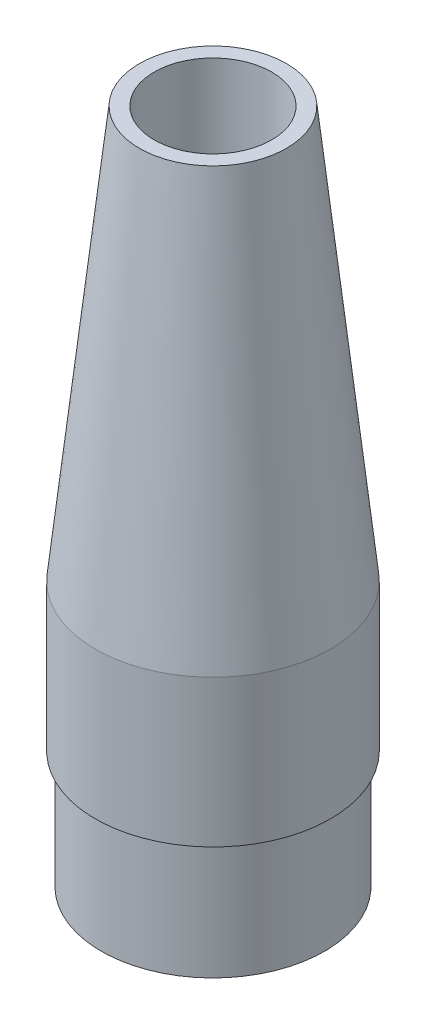
ISO-10303-21;
HEADER;
FILE_DESCRIPTION(('STEP AP214'),'2;1');
FILE_NAME('part.step','',(''),(''),'','','');
FILE_SCHEMA(('AUTOMOTIVE_DESIGN { 1 0 10303 214 1 1 1 1 }'));
ENDSEC;
DATA;
#1=APPLICATION_CONTEXT('core data for automotive mechanical design processes');
#2=APPLICATION_PROTOCOL_DEFINITION('international standard','automotive_design',2000,#1);
#3=PRODUCT_CONTEXT('',#1,'mechanical');
#4=PRODUCT('Part','Part','',(#3));
#5=PRODUCT_RELATED_PRODUCT_CATEGORY('part','',(#4));
#6=PRODUCT_DEFINITION_FORMATION('','',#4);
#7=PRODUCT_DEFINITION_CONTEXT('part definition',#1,'design');
#8=PRODUCT_DEFINITION('design','',#6,#7);
#9=PRODUCT_DEFINITION_SHAPE('','',#8);
#10=(LENGTH_UNIT() NAMED_UNIT(*) SI_UNIT(.MILLI.,.METRE.));
#11=(NAMED_UNIT(*) PLANE_ANGLE_UNIT() SI_UNIT($,.RADIAN.));
#12=(NAMED_UNIT(*) SI_UNIT($,.STERADIAN.) SOLID_ANGLE_UNIT());
#13=UNCERTAINTY_MEASURE_WITH_UNIT(LENGTH_MEASURE(1.E-05),#10,'distance_accuracy_value','');
#14=(GEOMETRIC_REPRESENTATION_CONTEXT(3) GLOBAL_UNCERTAINTY_ASSIGNED_CONTEXT((#13)) GLOBAL_UNIT_ASSIGNED_CONTEXT((#10,
#11,#12)) REPRESENTATION_CONTEXT('',''));
#15=CARTESIAN_POINT('',(0.,0.,0.));
#16=DIRECTION('',(0.,0.,1.));
#17=DIRECTION('',(1.,0.,0.));
#18=AXIS2_PLACEMENT_3D('',#15,#16,#17);
#19=CARTESIAN_POINT('',(0.,0.,0.));
#20=DIRECTION('',(0.,-1.,0.));
#21=DIRECTION('',(0.,0.,-1.));
#22=AXIS2_PLACEMENT_3D('',#19,#20,#21);
#23=CYLINDRICAL_SURFACE('',#22,19.);
#24=CARTESIAN_POINT('',(0.,20.,0.));
#25=DIRECTION('',(0.,-1.,0.));
#26=DIRECTION('',(0.,0.,-1.));
#27=AXIS2_PLACEMENT_3D('',#24,#25,#26);
#28=CIRCLE('',#27,19.);
#29=CARTESIAN_POINT('',(0.,20.,-19.));
#30=VERTEX_POINT('',#29);
#31=EDGE_CURVE('E74',#30,#30,#28,.T.);
#32=ORIENTED_EDGE('',*,*,#31,.T.);
#33=EDGE_LOOP('',(#32));
#34=FACE_BOUND('',#33,.T.);
#35=CARTESIAN_POINT('',(0.,0.,0.));
#36=DIRECTION('',(0.,-1.,0.));
#37=DIRECTION('',(0.,0.,-1.));
#38=AXIS2_PLACEMENT_3D('',#35,#36,#37);
#39=CIRCLE('',#38,19.);
#40=CARTESIAN_POINT('',(0.,0.,-19.));
#41=VERTEX_POINT('',#40);
#42=EDGE_CURVE('E10',#41,#41,#39,.T.);
#43=ORIENTED_EDGE('',*,*,#42,.F.);
#44=EDGE_LOOP('',(#43));
#45=FACE_BOUND('',#44,.T.);
#46=ADVANCED_FACE('F31',(#34,#45),#23,.T.);
#47=CARTESIAN_POINT('',(10.,0.,0.));
#48=DIRECTION('',(0.,-1.,0.));
#49=DIRECTION('',(0.,0.,-1.));
#50=AXIS2_PLACEMENT_3D('',#47,#48,#49);
#51=PLANE('',#50);
#52=ORIENTED_EDGE('',*,*,#42,.T.);
#53=EDGE_LOOP('',(#52));
#54=FACE_BOUND('',#53,.T.);
#55=CARTESIAN_POINT('',(0.,0.,0.));
#56=DIRECTION('',(0.,-1.,0.));
#57=DIRECTION('',(0.,0.,-1.));
#58=AXIS2_PLACEMENT_3D('',#55,#56,#57);
#59=CIRCLE('',#58,10.);
#60=CARTESIAN_POINT('',(0.,0.,-10.));
#61=VERTEX_POINT('',#60);
#62=EDGE_CURVE('E37',#61,#61,#59,.T.);
#63=ORIENTED_EDGE('',*,*,#62,.F.);
#64=EDGE_LOOP('',(#63));
#65=FACE_BOUND('',#64,.T.);
#66=ADVANCED_FACE('F92',(#54,#65),#51,.T.);
#67=CARTESIAN_POINT('',(0.,0.,0.));
#68=DIRECTION('',(0.,-1.,0.));
#69=DIRECTION('',(0.,0.,-1.));
#70=AXIS2_PLACEMENT_3D('',#67,#68,#69);
#71=CYLINDRICAL_SURFACE('',#70,9.99999999999999);
#72=ORIENTED_EDGE('',*,*,#62,.T.);
#73=EDGE_LOOP('',(#72));
#74=FACE_BOUND('',#73,.T.);
#75=CARTESIAN_POINT('',(0.,70.5531926730158,0.));
#76=DIRECTION('',(0.,-1.,0.));
#77=DIRECTION('',(0.,0.,-1.));
#78=AXIS2_PLACEMENT_3D('',#75,#76,#77);
#79=CIRCLE('',#78,9.99999999999999);
#80=CARTESIAN_POINT('',(0.,70.5531926730158,-9.99999999999999));
#81=VERTEX_POINT('',#80);
#82=EDGE_CURVE('E41',#81,#81,#79,.T.);
#83=ORIENTED_EDGE('',*,*,#82,.F.);
#84=EDGE_LOOP('',(#83));
#85=FACE_BOUND('',#84,.T.);
#86=ADVANCED_FACE('F96',(#74,#85),#71,.F.);
#87=CARTESIAN_POINT('',(0.,75.8138195536944,0.));
#88=DIRECTION('',(0.,-1.,0.));
#89=DIRECTION('',(0.,0.,-1.));
#90=AXIS2_PLACEMENT_3D('',#87,#88,#89);
#91=CONICAL_SURFACE('',#90,7.78273050664267,0.398888707048109);
#92=ORIENTED_EDGE('',*,*,#82,.T.);
#93=EDGE_LOOP('',(#92));
#94=FACE_BOUND('',#93,.T.);
#95=CARTESIAN_POINT('',(0.,75.8138195536944,0.));
#96=DIRECTION('',(0.,-1.,0.));
#97=DIRECTION('',(0.,0.,-1.));
#98=AXIS2_PLACEMENT_3D('',#95,#96,#97);
#99=CIRCLE('',#98,7.78273050664267);
#100=CARTESIAN_POINT('',(0.,75.8138195536944,-7.78273050664267));
#101=VERTEX_POINT('',#100);
#102=EDGE_CURVE('E45',#101,#101,#99,.T.);
#103=ORIENTED_EDGE('',*,*,#102,.F.);
#104=EDGE_LOOP('',(#103));
#105=FACE_BOUND('',#104,.T.);
#106=ADVANCED_FACE('F100',(#94,#105),#91,.F.);
#107=CARTESIAN_POINT('',(0.,0.,0.));
#108=DIRECTION('',(0.,-1.,0.));
#109=DIRECTION('',(0.,0.,-1.));
#110=AXIS2_PLACEMENT_3D('',#107,#108,#109);
#111=CYLINDRICAL_SURFACE('',#110,7.78273050664267);
#112=ORIENTED_EDGE('',*,*,#102,.T.);
#113=EDGE_LOOP('',(#112));
#114=FACE_BOUND('',#113,.T.);
#115=CARTESIAN_POINT('',(0.,80.,0.));
#116=DIRECTION('',(0.,-1.,0.));
#117=DIRECTION('',(0.,0.,-1.));
#118=AXIS2_PLACEMENT_3D('',#115,#116,#117);
#119=CIRCLE('',#118,7.78273050664266);
#120=CARTESIAN_POINT('',(0.,80.,-7.78273050664266));
#121=VERTEX_POINT('',#120);
#122=EDGE_CURVE('E50',#121,#121,#119,.T.);
#123=ORIENTED_EDGE('',*,*,#122,.F.);
#124=EDGE_LOOP('',(#123));
#125=FACE_BOUND('',#124,.T.);
#126=ADVANCED_FACE('F106',(#114,#125),#111,.F.);
#127=CARTESIAN_POINT('',(5.,80.,0.));
#128=DIRECTION('',(0.,-1.,0.));
#129=DIRECTION('',(0.,0.,-1.));
#130=AXIS2_PLACEMENT_3D('',#127,#128,#129);
#131=PLANE('',#130);
#132=ORIENTED_EDGE('',*,*,#122,.T.);
#133=EDGE_LOOP('',(#132));
#134=FACE_BOUND('',#133,.T.);
#135=CARTESIAN_POINT('',(0.,80.,0.));
#136=DIRECTION('',(0.,-1.,0.));
#137=DIRECTION('',(0.,0.,-1.));
#138=AXIS2_PLACEMENT_3D('',#135,#136,#137);
#139=CIRCLE('',#138,5.);
#140=CARTESIAN_POINT('',(0.,80.,-5.));
#141=VERTEX_POINT('',#140);
#142=EDGE_CURVE('E53',#141,#141,#139,.T.);
#143=ORIENTED_EDGE('',*,*,#142,.F.);
#144=EDGE_LOOP('',(#143));
#145=FACE_BOUND('',#144,.T.);
#146=ADVANCED_FACE('F110',(#134,#145),#131,.T.);
#147=CARTESIAN_POINT('',(0.,0.,0.));
#148=DIRECTION('',(0.,-1.,0.));
#149=DIRECTION('',(0.,0.,-1.));
#150=AXIS2_PLACEMENT_3D('',#147,#148,#149);
#151=CYLINDRICAL_SURFACE('',#150,5.);
#152=ORIENTED_EDGE('',*,*,#142,.T.);
#153=EDGE_LOOP('',(#152));
#154=FACE_BOUND('',#153,.T.);
#155=CARTESIAN_POINT('',(0.,85.,0.));
#156=DIRECTION('',(0.,-1.,0.));
#157=DIRECTION('',(0.,0.,-1.));
#158=AXIS2_PLACEMENT_3D('',#155,#156,#157);
#159=CIRCLE('',#158,5.);
#160=CARTESIAN_POINT('',(0.,85.,-5.));
#161=VERTEX_POINT('',#160);
#162=EDGE_CURVE('E56',#161,#161,#159,.T.);
#163=ORIENTED_EDGE('',*,*,#162,.F.);
#164=EDGE_LOOP('',(#163));
#165=FACE_BOUND('',#164,.T.);
#166=ADVANCED_FACE('F114',(#154,#165),#151,.F.);
#167=CARTESIAN_POINT('',(10.,85.,0.));
#168=DIRECTION('',(0.,1.,0.));
#169=DIRECTION('',(0.,0.,1.));
#170=AXIS2_PLACEMENT_3D('',#167,#168,#169);
#171=PLANE('',#170);
#172=ORIENTED_EDGE('',*,*,#162,.T.);
#173=EDGE_LOOP('',(#172));
#174=FACE_BOUND('',#173,.T.);
#175=CARTESIAN_POINT('',(0.,85.,0.));
#176=DIRECTION('',(0.,-1.,0.));
#177=DIRECTION('',(0.,0.,-1.));
#178=AXIS2_PLACEMENT_3D('',#175,#176,#177);
#179=CIRCLE('',#178,10.);
#180=CARTESIAN_POINT('',(0.,85.,-10.));
#181=VERTEX_POINT('',#180);
#182=EDGE_CURVE('E59',#181,#181,#179,.T.);
#183=ORIENTED_EDGE('',*,*,#182,.F.);
#184=EDGE_LOOP('',(#183));
#185=FACE_BOUND('',#184,.T.);
#186=ADVANCED_FACE('F118',(#174,#185),#171,.T.);
#187=CARTESIAN_POINT('',(0.,0.,0.));
#188=DIRECTION('',(0.,-1.,0.));
#189=DIRECTION('',(0.,0.,-1.));
#190=AXIS2_PLACEMENT_3D('',#187,#188,#189);
#191=CYLINDRICAL_SURFACE('',#190,10.);
#192=ORIENTED_EDGE('',*,*,#182,.T.);
#193=EDGE_LOOP('',(#192));
#194=FACE_BOUND('',#193,.T.);
#195=CARTESIAN_POINT('',(0.,115.,0.));
#196=DIRECTION('',(0.,-1.,0.));
#197=DIRECTION('',(0.,0.,-1.));
#198=AXIS2_PLACEMENT_3D('',#195,#196,#197);
#199=CIRCLE('',#198,10.);
#200=CARTESIAN_POINT('',(0.,115.,-10.));
#201=VERTEX_POINT('',#200);
#202=EDGE_CURVE('E62',#201,#201,#199,.T.);
#203=ORIENTED_EDGE('',*,*,#202,.F.);
#204=EDGE_LOOP('',(#203));
#205=FACE_BOUND('',#204,.T.);
#206=ADVANCED_FACE('F122',(#194,#205),#191,.F.);
#207=CARTESIAN_POINT('',(12.5,115.,0.));
#208=DIRECTION('',(0.,1.,0.));
#209=DIRECTION('',(0.,0.,1.));
#210=AXIS2_PLACEMENT_3D('',#207,#208,#209);
#211=PLANE('',#210);
#212=ORIENTED_EDGE('',*,*,#202,.T.);
#213=EDGE_LOOP('',(#212));
#214=FACE_BOUND('',#213,.T.);
#215=CARTESIAN_POINT('',(0.,115.,0.));
#216=DIRECTION('',(0.,-1.,0.));
#217=DIRECTION('',(0.,0.,-1.));
#218=AXIS2_PLACEMENT_3D('',#215,#216,#217);
#219=CIRCLE('',#218,12.5);
#220=CARTESIAN_POINT('',(0.,115.,-12.5));
#221=VERTEX_POINT('',#220);
#222=EDGE_CURVE('E65',#221,#221,#219,.T.);
#223=ORIENTED_EDGE('',*,*,#222,.F.);
#224=EDGE_LOOP('',(#223));
#225=FACE_BOUND('',#224,.T.);
#226=ADVANCED_FACE('F126',(#214,#225),#211,.T.);
#227=CARTESIAN_POINT('',(0.,45.,0.));
#228=DIRECTION('',(0.,-1.,0.));
#229=DIRECTION('',(0.,0.,-1.));
#230=AXIS2_PLACEMENT_3D('',#227,#228,#229);
#231=CONICAL_SURFACE('',#230,20.,0.106735672649136);
#232=ORIENTED_EDGE('',*,*,#222,.T.);
#233=EDGE_LOOP('',(#232));
#234=FACE_BOUND('',#233,.T.);
#235=CARTESIAN_POINT('',(0.,45.,0.));
#236=DIRECTION('',(0.,-1.,0.));
#237=DIRECTION('',(0.,0.,-1.));
#238=AXIS2_PLACEMENT_3D('',#235,#236,#237);
#239=CIRCLE('',#238,20.);
#240=CARTESIAN_POINT('',(0.,45.,-20.));
#241=VERTEX_POINT('',#240);
#242=EDGE_CURVE('E68',#241,#241,#239,.T.);
#243=ORIENTED_EDGE('',*,*,#242,.F.);
#244=EDGE_LOOP('',(#243));
#245=FACE_BOUND('',#244,.T.);
#246=ADVANCED_FACE('F88',(#234,#245),#231,.T.);
#247=CARTESIAN_POINT('',(0.,0.,0.));
#248=DIRECTION('',(0.,-1.,0.));
#249=DIRECTION('',(0.,0.,-1.));
#250=AXIS2_PLACEMENT_3D('',#247,#248,#249);
#251=CYLINDRICAL_SURFACE('',#250,20.);
#252=ORIENTED_EDGE('',*,*,#242,.T.);
#253=EDGE_LOOP('',(#252));
#254=FACE_BOUND('',#253,.T.);
#255=CARTESIAN_POINT('',(0.,20.,0.));
#256=DIRECTION('',(0.,-1.,0.));
#257=DIRECTION('',(0.,0.,-1.));
#258=AXIS2_PLACEMENT_3D('',#255,#256,#257);
#259=CIRCLE('',#258,20.);
#260=CARTESIAN_POINT('',(0.,20.,-20.));
#261=VERTEX_POINT('',#260);
#262=EDGE_CURVE('E71',#261,#261,#259,.T.);
#263=ORIENTED_EDGE('',*,*,#262,.F.);
#264=EDGE_LOOP('',(#263));
#265=FACE_BOUND('',#264,.T.);
#266=ADVANCED_FACE('F82',(#254,#265),#251,.T.);
#267=CARTESIAN_POINT('',(19.,20.,0.));
#268=DIRECTION('',(0.,-1.,0.));
#269=DIRECTION('',(0.,0.,-1.));
#270=AXIS2_PLACEMENT_3D('',#267,#268,#269);
#271=PLANE('',#270);
#272=ORIENTED_EDGE('',*,*,#262,.T.);
#273=EDGE_LOOP('',(#272));
#274=FACE_BOUND('',#273,.T.);
#275=ORIENTED_EDGE('',*,*,#31,.F.);
#276=EDGE_LOOP('',(#275));
#277=FACE_BOUND('',#276,.T.);
#278=ADVANCED_FACE('F80',(#274,#277),#271,.T.);
#279=CLOSED_SHELL('',(#46,#66,#86,#106,#126,#146,#166,#186,#206,#226,#246,#266,#278));
#280=MANIFOLD_SOLID_BREP('B2',#279);
#281=ADVANCED_BREP_SHAPE_REPRESENTATION('',(#18,#280),#14);
#282=SHAPE_DEFINITION_REPRESENTATION(#9,#281);
ENDSEC;
END-ISO-10303-21;
